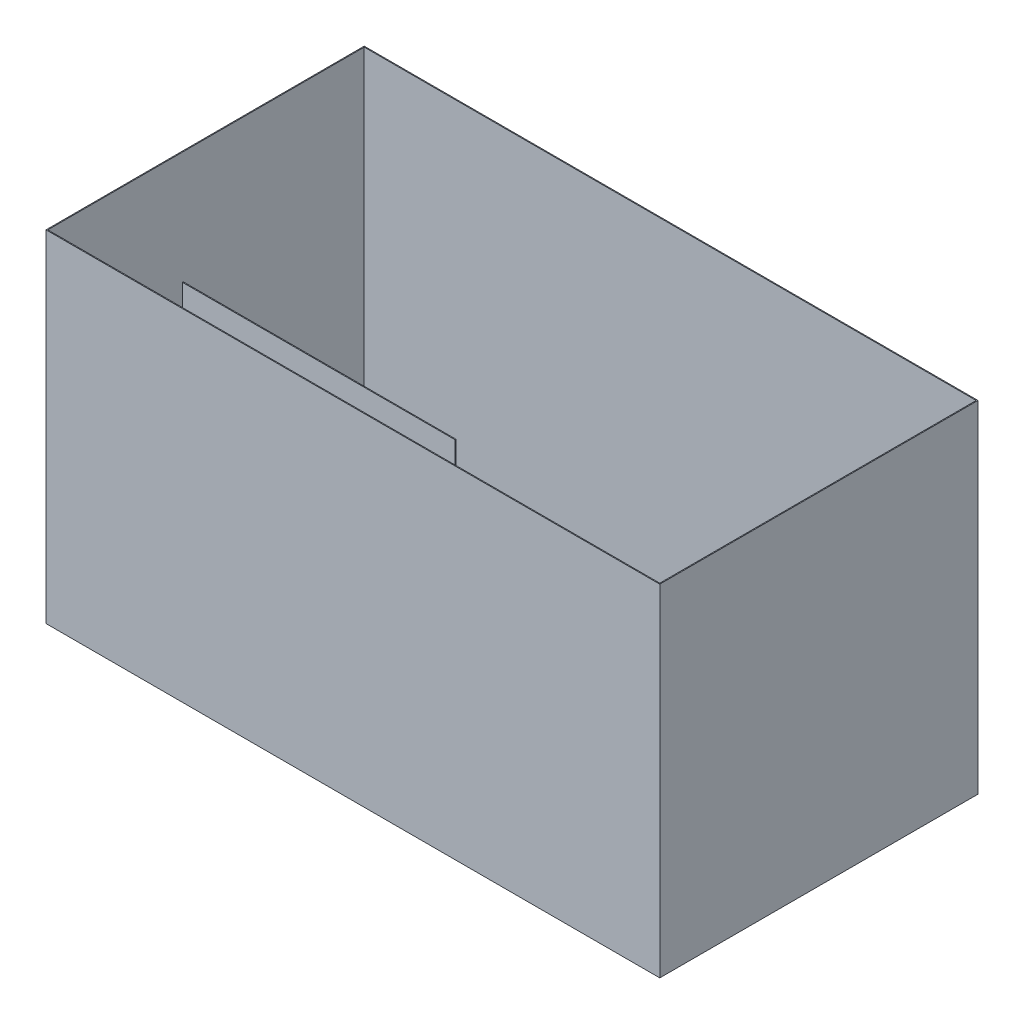
ISO-10303-21;
HEADER;
FILE_DESCRIPTION(('STEP AP214'),'2;1');
FILE_NAME('part.step','',(''),(''),'','','');
FILE_SCHEMA(('AUTOMOTIVE_DESIGN { 1 0 10303 214 1 1 1 1 }'));
ENDSEC;
DATA;
#1=APPLICATION_CONTEXT('core data for automotive mechanical design processes');
#2=APPLICATION_PROTOCOL_DEFINITION('international standard','automotive_design',2000,#1);
#3=PRODUCT_CONTEXT('',#1,'mechanical');
#4=PRODUCT('Part','Part','',(#3));
#5=PRODUCT_RELATED_PRODUCT_CATEGORY('part','',(#4));
#6=PRODUCT_DEFINITION_FORMATION('','',#4);
#7=PRODUCT_DEFINITION_CONTEXT('part definition',#1,'design');
#8=PRODUCT_DEFINITION('design','',#6,#7);
#9=PRODUCT_DEFINITION_SHAPE('','',#8);
#10=(LENGTH_UNIT() NAMED_UNIT(*) SI_UNIT(.MILLI.,.METRE.));
#11=(NAMED_UNIT(*) PLANE_ANGLE_UNIT() SI_UNIT($,.RADIAN.));
#12=(NAMED_UNIT(*) SI_UNIT($,.STERADIAN.) SOLID_ANGLE_UNIT());
#13=UNCERTAINTY_MEASURE_WITH_UNIT(LENGTH_MEASURE(1.E-05),#10,'distance_accuracy_value','');
#14=(GEOMETRIC_REPRESENTATION_CONTEXT(3) GLOBAL_UNCERTAINTY_ASSIGNED_CONTEXT((#13)) GLOBAL_UNIT_ASSIGNED_CONTEXT((#10,
#11,#12)) REPRESENTATION_CONTEXT('',''));
#15=CARTESIAN_POINT('',(0.,0.,0.));
#16=DIRECTION('',(0.,0.,1.));
#17=DIRECTION('',(1.,0.,0.));
#18=AXIS2_PLACEMENT_3D('',#15,#16,#17);
#19=CARTESIAN_POINT('',(50.,550.,-250.));
#20=DIRECTION('',(1.,0.,0.));
#21=DIRECTION('',(0.,0.,-1.));
#22=AXIS2_PLACEMENT_3D('',#19,#20,#21);
#23=PLANE('',#22);
#24=DIRECTION('',(0.,0.,1.));
#25=VECTOR('',#24,1.);
#26=CARTESIAN_POINT('',(50.,100.,-250.));
#27=LINE('',#26,#25);
#28=CARTESIAN_POINT('',(50.,100.,-252.));
#29=VERTEX_POINT('',#28);
#30=CARTESIAN_POINT('',(50.,100.,-250.));
#31=VERTEX_POINT('',#30);
#32=EDGE_CURVE('E116',#29,#31,#27,.T.);
#33=ORIENTED_EDGE('',*,*,#32,.T.);
#34=DIRECTION('',(0.,-1.,0.));
#35=VECTOR('',#34,1.);
#36=CARTESIAN_POINT('',(50.,550.,-250.));
#37=LINE('',#36,#35);
#38=CARTESIAN_POINT('',(50.,550.,-250.));
#39=VERTEX_POINT('',#38);
#40=EDGE_CURVE('E12',#39,#31,#37,.T.);
#41=ORIENTED_EDGE('',*,*,#40,.F.);
#42=DIRECTION('',(0.,0.,1.));
#43=VECTOR('',#42,1.);
#44=CARTESIAN_POINT('',(50.,550.,-250.));
#45=LINE('',#44,#43);
#46=CARTESIAN_POINT('',(50.,550.,-252.));
#47=VERTEX_POINT('',#46);
#48=EDGE_CURVE('E102',#47,#39,#45,.T.);
#49=ORIENTED_EDGE('',*,*,#48,.F.);
#50=DIRECTION('',(0.,-1.,0.));
#51=VECTOR('',#50,1.);
#52=CARTESIAN_POINT('',(50.,550.,-252.));
#53=LINE('',#52,#51);
#54=EDGE_CURVE('E115',#47,#29,#53,.T.);
#55=ORIENTED_EDGE('',*,*,#54,.T.);
#56=EDGE_LOOP('',(#33,#41,#49,#55));
#57=FACE_BOUND('',#56,.T.);
#58=ADVANCED_FACE('F52',(#57),#23,.F.);
#59=CARTESIAN_POINT('',(50.,550.,-250.));
#60=DIRECTION('',(0.,0.,-1.));
#61=DIRECTION('',(-1.,0.,0.));
#62=AXIS2_PLACEMENT_3D('',#59,#60,#61);
#63=PLANE('',#62);
#64=DIRECTION('',(1.,0.,0.));
#65=VECTOR('',#64,1.);
#66=CARTESIAN_POINT('',(50.,100.,-250.));
#67=LINE('',#66,#65);
#68=CARTESIAN_POINT('',(650.,100.,-250.));
#69=VERTEX_POINT('',#68);
#70=EDGE_CURVE('E107',#31,#69,#67,.T.);
#71=ORIENTED_EDGE('',*,*,#70,.T.);
#72=DIRECTION('',(0.,-1.,0.));
#73=VECTOR('',#72,1.);
#74=CARTESIAN_POINT('',(650.,550.,-250.));
#75=LINE('',#74,#73);
#76=CARTESIAN_POINT('',(650.,550.,-250.));
#77=VERTEX_POINT('',#76);
#78=EDGE_CURVE('E61',#77,#69,#75,.T.);
#79=ORIENTED_EDGE('',*,*,#78,.F.);
#80=DIRECTION('',(1.,0.,0.));
#81=VECTOR('',#80,1.);
#82=CARTESIAN_POINT('',(50.,550.,-250.));
#83=LINE('',#82,#81);
#84=EDGE_CURVE('E97',#39,#77,#83,.T.);
#85=ORIENTED_EDGE('',*,*,#84,.F.);
#86=ORIENTED_EDGE('',*,*,#40,.T.);
#87=EDGE_LOOP('',(#71,#79,#85,#86));
#88=FACE_BOUND('',#87,.T.);
#89=ADVANCED_FACE('F110',(#88),#63,.F.);
#90=CARTESIAN_POINT('',(650.,550.,-250.));
#91=DIRECTION('',(-1.,0.,0.));
#92=DIRECTION('',(0.,0.,1.));
#93=AXIS2_PLACEMENT_3D('',#90,#91,#92);
#94=PLANE('',#93);
#95=DIRECTION('',(0.,0.,-1.));
#96=VECTOR('',#95,1.);
#97=CARTESIAN_POINT('',(650.,100.,-250.));
#98=LINE('',#97,#96);
#99=CARTESIAN_POINT('',(650.,100.,-252.));
#100=VERTEX_POINT('',#99);
#101=EDGE_CURVE('E88',#69,#100,#98,.T.);
#102=ORIENTED_EDGE('',*,*,#101,.T.);
#103=DIRECTION('',(0.,-1.,0.));
#104=VECTOR('',#103,1.);
#105=CARTESIAN_POINT('',(650.,550.,-252.));
#106=LINE('',#105,#104);
#107=CARTESIAN_POINT('',(650.,550.,-252.));
#108=VERTEX_POINT('',#107);
#109=EDGE_CURVE('E108',#108,#100,#106,.T.);
#110=ORIENTED_EDGE('',*,*,#109,.F.);
#111=DIRECTION('',(0.,0.,-1.));
#112=VECTOR('',#111,1.);
#113=CARTESIAN_POINT('',(650.,550.,-250.));
#114=LINE('',#113,#112);
#115=EDGE_CURVE('E105',#77,#108,#114,.T.);
#116=ORIENTED_EDGE('',*,*,#115,.F.);
#117=ORIENTED_EDGE('',*,*,#78,.T.);
#118=EDGE_LOOP('',(#102,#110,#116,#117));
#119=FACE_BOUND('',#118,.T.);
#120=ADVANCED_FACE('F109',(#119),#94,.F.);
#121=CARTESIAN_POINT('',(50.,550.,-252.));
#122=DIRECTION('',(0.,0.,1.));
#123=DIRECTION('',(1.,0.,0.));
#124=AXIS2_PLACEMENT_3D('',#121,#122,#123);
#125=PLANE('',#124);
#126=DIRECTION('',(-1.,0.,0.));
#127=VECTOR('',#126,1.);
#128=CARTESIAN_POINT('',(50.,100.,-252.));
#129=LINE('',#128,#127);
#130=EDGE_CURVE('E95',#100,#29,#129,.T.);
#131=ORIENTED_EDGE('',*,*,#130,.T.);
#132=ORIENTED_EDGE('',*,*,#54,.F.);
#133=DIRECTION('',(-1.,0.,0.));
#134=VECTOR('',#133,1.);
#135=CARTESIAN_POINT('',(50.,550.,-252.));
#136=LINE('',#135,#134);
#137=EDGE_CURVE('E66',#108,#47,#136,.T.);
#138=ORIENTED_EDGE('',*,*,#137,.F.);
#139=ORIENTED_EDGE('',*,*,#109,.T.);
#140=EDGE_LOOP('',(#131,#132,#138,#139));
#141=FACE_BOUND('',#140,.T.);
#142=ADVANCED_FACE('F125',(#141),#125,.F.);
#143=CARTESIAN_POINT('',(0.,550.,0.));
#144=DIRECTION('',(0.,-1.,0.));
#145=DIRECTION('',(0.,0.,-1.));
#146=AXIS2_PLACEMENT_3D('',#143,#144,#145);
#147=PLANE('',#146);
#148=ORIENTED_EDGE('',*,*,#48,.T.);
#149=ORIENTED_EDGE('',*,*,#84,.T.);
#150=ORIENTED_EDGE('',*,*,#115,.T.);
#151=ORIENTED_EDGE('',*,*,#137,.T.);
#152=EDGE_LOOP('',(#148,#149,#150,#151));
#153=FACE_BOUND('',#152,.T.);
#154=ADVANCED_FACE('F99',(#153),#147,.F.);
#155=CARTESIAN_POINT('',(0.,100.,0.));
#156=DIRECTION('',(0.,-1.,0.));
#157=DIRECTION('',(0.,0.,-1.));
#158=AXIS2_PLACEMENT_3D('',#155,#156,#157);
#159=PLANE('',#158);
#160=ORIENTED_EDGE('',*,*,#32,.F.);
#161=ORIENTED_EDGE('',*,*,#130,.F.);
#162=ORIENTED_EDGE('',*,*,#101,.F.);
#163=ORIENTED_EDGE('',*,*,#70,.F.);
#164=EDGE_LOOP('',(#160,#161,#162,#163));
#165=FACE_BOUND('',#164,.T.);
#166=ADVANCED_FACE('F127',(#165),#159,.T.);
#167=CLOSED_SHELL('',(#58,#89,#120,#142,#154,#166));
#168=MANIFOLD_SOLID_BREP('B2',#167);
#169=CARTESIAN_POINT('',(0.,750.,0.));
#170=DIRECTION('',(0.,-1.,0.));
#171=DIRECTION('',(0.,0.,-1.));
#172=AXIS2_PLACEMENT_3D('',#169,#170,#171);
#173=PLANE('',#172);
#174=DIRECTION('',(0.,0.,1.));
#175=VECTOR('',#174,1.);
#176=CARTESIAN_POINT('',(0.,750.,0.));
#177=LINE('',#176,#175);
#178=CARTESIAN_POINT('',(0.,750.,-700.));
#179=VERTEX_POINT('',#178);
#180=CARTESIAN_POINT('',(0.,750.,0.));
#181=VERTEX_POINT('',#180);
#182=EDGE_CURVE('E285',#179,#181,#177,.T.);
#183=ORIENTED_EDGE('',*,*,#182,.T.);
#184=DIRECTION('',(1.,0.,0.));
#185=VECTOR('',#184,1.);
#186=CARTESIAN_POINT('',(0.,750.,0.));
#187=LINE('',#186,#185);
#188=CARTESIAN_POINT('',(1350.,750.,0.));
#189=VERTEX_POINT('',#188);
#190=EDGE_CURVE('E228',#181,#189,#187,.T.);
#191=ORIENTED_EDGE('',*,*,#190,.T.);
#192=DIRECTION('',(0.,0.,-1.));
#193=VECTOR('',#192,1.);
#194=CARTESIAN_POINT('',(1350.,750.,0.));
#195=LINE('',#194,#193);
#196=CARTESIAN_POINT('',(1350.,750.,-700.));
#197=VERTEX_POINT('',#196);
#198=EDGE_CURVE('E290',#189,#197,#195,.T.);
#199=ORIENTED_EDGE('',*,*,#198,.T.);
#200=DIRECTION('',(-1.,0.,0.));
#201=VECTOR('',#200,1.);
#202=CARTESIAN_POINT('',(0.,750.,-700.));
#203=LINE('',#202,#201);
#204=EDGE_CURVE('E203',#197,#179,#203,.T.);
#205=ORIENTED_EDGE('',*,*,#204,.T.);
#206=EDGE_LOOP('',(#183,#191,#199,#205));
#207=FACE_BOUND('',#206,.T.);
#208=DIRECTION('',(0.,0.,1.));
#209=VECTOR('',#208,1.);
#210=CARTESIAN_POINT('',(2.,750.,0.));
#211=LINE('',#210,#209);
#212=CARTESIAN_POINT('',(2.,750.,-698.));
#213=VERTEX_POINT('',#212);
#214=CARTESIAN_POINT('',(2.,750.,-2.));
#215=VERTEX_POINT('',#214);
#216=EDGE_CURVE('E273',#213,#215,#211,.T.);
#217=ORIENTED_EDGE('',*,*,#216,.F.);
#218=DIRECTION('',(-1.,0.,0.));
#219=VECTOR('',#218,1.);
#220=CARTESIAN_POINT('',(0.,750.,-698.));
#221=LINE('',#220,#219);
#222=CARTESIAN_POINT('',(1348.,750.,-698.));
#223=VERTEX_POINT('',#222);
#224=EDGE_CURVE('E284',#223,#213,#221,.T.);
#225=ORIENTED_EDGE('',*,*,#224,.F.);
#226=DIRECTION('',(0.,0.,-1.));
#227=VECTOR('',#226,1.);
#228=CARTESIAN_POINT('',(1348.,750.,0.));
#229=LINE('',#228,#227);
#230=CARTESIAN_POINT('',(1348.,750.,-2.));
#231=VERTEX_POINT('',#230);
#232=EDGE_CURVE('E281',#231,#223,#229,.T.);
#233=ORIENTED_EDGE('',*,*,#232,.F.);
#234=DIRECTION('',(1.,0.,0.));
#235=VECTOR('',#234,1.);
#236=CARTESIAN_POINT('',(0.,750.,-2.));
#237=LINE('',#236,#235);
#238=EDGE_CURVE('E266',#215,#231,#237,.T.);
#239=ORIENTED_EDGE('',*,*,#238,.F.);
#240=EDGE_LOOP('',(#217,#225,#233,#239));
#241=FACE_BOUND('',#240,.T.);
#242=ADVANCED_FACE('F179',(#207,#241),#173,.F.);
#243=CARTESIAN_POINT('',(0.,750.,0.));
#244=DIRECTION('',(1.,0.,0.));
#245=DIRECTION('',(0.,0.,-1.));
#246=AXIS2_PLACEMENT_3D('',#243,#244,#245);
#247=PLANE('',#246);
#248=DIRECTION('',(0.,0.,1.));
#249=VECTOR('',#248,1.);
#250=CARTESIAN_POINT('',(0.,0.,0.));
#251=LINE('',#250,#249);
#252=CARTESIAN_POINT('',(0.,0.,-700.));
#253=VERTEX_POINT('',#252);
#254=CARTESIAN_POINT('',(0.,0.,0.));
#255=VERTEX_POINT('',#254);
#256=EDGE_CURVE('E295',#253,#255,#251,.T.);
#257=ORIENTED_EDGE('',*,*,#256,.T.);
#258=DIRECTION('',(0.,-1.,0.));
#259=VECTOR('',#258,1.);
#260=CARTESIAN_POINT('',(0.,750.,0.));
#261=LINE('',#260,#259);
#262=EDGE_CURVE('E51',#181,#255,#261,.T.);
#263=ORIENTED_EDGE('',*,*,#262,.F.);
#264=ORIENTED_EDGE('',*,*,#182,.F.);
#265=DIRECTION('',(0.,-1.,0.));
#266=VECTOR('',#265,1.);
#267=CARTESIAN_POINT('',(0.,750.,-700.));
#268=LINE('',#267,#266);
#269=EDGE_CURVE('E292',#179,#253,#268,.T.);
#270=ORIENTED_EDGE('',*,*,#269,.T.);
#271=EDGE_LOOP('',(#257,#263,#264,#270));
#272=FACE_BOUND('',#271,.T.);
#273=ADVANCED_FACE('F176',(#272),#247,.F.);
#274=CARTESIAN_POINT('',(0.,750.,0.));
#275=DIRECTION('',(0.,0.,-1.));
#276=DIRECTION('',(-1.,0.,0.));
#277=AXIS2_PLACEMENT_3D('',#274,#275,#276);
#278=PLANE('',#277);
#279=DIRECTION('',(1.,0.,0.));
#280=VECTOR('',#279,1.);
#281=CARTESIAN_POINT('',(0.,0.,0.));
#282=LINE('',#281,#280);
#283=CARTESIAN_POINT('',(1350.,0.,0.));
#284=VERTEX_POINT('',#283);
#285=EDGE_CURVE('E293',#255,#284,#282,.T.);
#286=ORIENTED_EDGE('',*,*,#285,.T.);
#287=DIRECTION('',(0.,-1.,0.));
#288=VECTOR('',#287,1.);
#289=CARTESIAN_POINT('',(1350.,750.,0.));
#290=LINE('',#289,#288);
#291=EDGE_CURVE('E183',#189,#284,#290,.T.);
#292=ORIENTED_EDGE('',*,*,#291,.F.);
#293=ORIENTED_EDGE('',*,*,#190,.F.);
#294=ORIENTED_EDGE('',*,*,#262,.T.);
#295=EDGE_LOOP('',(#286,#292,#293,#294));
#296=FACE_BOUND('',#295,.T.);
#297=ADVANCED_FACE('F323',(#296),#278,.F.);
#298=CARTESIAN_POINT('',(1350.,750.,0.));
#299=DIRECTION('',(-1.,0.,0.));
#300=DIRECTION('',(0.,0.,1.));
#301=AXIS2_PLACEMENT_3D('',#298,#299,#300);
#302=PLANE('',#301);
#303=DIRECTION('',(0.,0.,-1.));
#304=VECTOR('',#303,1.);
#305=CARTESIAN_POINT('',(1350.,0.,0.));
#306=LINE('',#305,#304);
#307=CARTESIAN_POINT('',(1350.,0.,-700.));
#308=VERTEX_POINT('',#307);
#309=EDGE_CURVE('E297',#284,#308,#306,.T.);
#310=ORIENTED_EDGE('',*,*,#309,.T.);
#311=DIRECTION('',(0.,-1.,0.));
#312=VECTOR('',#311,1.);
#313=CARTESIAN_POINT('',(1350.,750.,-700.));
#314=LINE('',#313,#312);
#315=EDGE_CURVE('E302',#197,#308,#314,.T.);
#316=ORIENTED_EDGE('',*,*,#315,.F.);
#317=ORIENTED_EDGE('',*,*,#198,.F.);
#318=ORIENTED_EDGE('',*,*,#291,.T.);
#319=EDGE_LOOP('',(#310,#316,#317,#318));
#320=FACE_BOUND('',#319,.T.);
#321=ADVANCED_FACE('F308',(#320),#302,.F.);
#322=CARTESIAN_POINT('',(0.,750.,-700.));
#323=DIRECTION('',(0.,0.,1.));
#324=DIRECTION('',(1.,0.,0.));
#325=AXIS2_PLACEMENT_3D('',#322,#323,#324);
#326=PLANE('',#325);
#327=DIRECTION('',(-1.,0.,0.));
#328=VECTOR('',#327,1.);
#329=CARTESIAN_POINT('',(0.,0.,-700.));
#330=LINE('',#329,#328);
#331=EDGE_CURVE('E225',#308,#253,#330,.T.);
#332=ORIENTED_EDGE('',*,*,#331,.T.);
#333=ORIENTED_EDGE('',*,*,#269,.F.);
#334=ORIENTED_EDGE('',*,*,#204,.F.);
#335=ORIENTED_EDGE('',*,*,#315,.T.);
#336=EDGE_LOOP('',(#332,#333,#334,#335));
#337=FACE_BOUND('',#336,.T.);
#338=ADVANCED_FACE('F314',(#337),#326,.F.);
#339=CARTESIAN_POINT('',(0.,0.,0.));
#340=DIRECTION('',(0.,-1.,0.));
#341=DIRECTION('',(0.,0.,-1.));
#342=AXIS2_PLACEMENT_3D('',#339,#340,#341);
#343=PLANE('',#342);
#344=ORIENTED_EDGE('',*,*,#256,.F.);
#345=ORIENTED_EDGE('',*,*,#331,.F.);
#346=ORIENTED_EDGE('',*,*,#309,.F.);
#347=ORIENTED_EDGE('',*,*,#285,.F.);
#348=EDGE_LOOP('',(#344,#345,#346,#347));
#349=FACE_BOUND('',#348,.T.);
#350=ADVANCED_FACE('F309',(#349),#343,.T.);
#351=CARTESIAN_POINT('',(2.,750.,0.));
#352=DIRECTION('',(1.,0.,0.));
#353=DIRECTION('',(0.,0.,-1.));
#354=AXIS2_PLACEMENT_3D('',#351,#352,#353);
#355=PLANE('',#354);
#356=DIRECTION('',(0.,0.,1.));
#357=VECTOR('',#356,1.);
#358=CARTESIAN_POINT('',(2.,2.,0.));
#359=LINE('',#358,#357);
#360=CARTESIAN_POINT('',(2.,2.,-698.));
#361=VERTEX_POINT('',#360);
#362=CARTESIAN_POINT('',(2.,2.,-2.));
#363=VERTEX_POINT('',#362);
#364=EDGE_CURVE('E260',#361,#363,#359,.T.);
#365=ORIENTED_EDGE('',*,*,#364,.F.);
#366=DIRECTION('',(0.,-1.,0.));
#367=VECTOR('',#366,1.);
#368=CARTESIAN_POINT('',(2.,750.,-698.));
#369=LINE('',#368,#367);
#370=EDGE_CURVE('E280',#213,#361,#369,.T.);
#371=ORIENTED_EDGE('',*,*,#370,.F.);
#372=ORIENTED_EDGE('',*,*,#216,.T.);
#373=DIRECTION('',(0.,-1.,0.));
#374=VECTOR('',#373,1.);
#375=CARTESIAN_POINT('',(2.,750.,-2.));
#376=LINE('',#375,#374);
#377=EDGE_CURVE('E267',#215,#363,#376,.T.);
#378=ORIENTED_EDGE('',*,*,#377,.T.);
#379=EDGE_LOOP('',(#365,#371,#372,#378));
#380=FACE_BOUND('',#379,.T.);
#381=ADVANCED_FACE('F321',(#380),#355,.T.);
#382=CARTESIAN_POINT('',(0.,750.,-2.));
#383=DIRECTION('',(0.,0.,-1.));
#384=DIRECTION('',(-1.,0.,0.));
#385=AXIS2_PLACEMENT_3D('',#382,#383,#384);
#386=PLANE('',#385);
#387=DIRECTION('',(1.,0.,0.));
#388=VECTOR('',#387,1.);
#389=CARTESIAN_POINT('',(0.,2.,-2.));
#390=LINE('',#389,#388);
#391=CARTESIAN_POINT('',(1348.,2.,-2.));
#392=VERTEX_POINT('',#391);
#393=EDGE_CURVE('E253',#363,#392,#390,.T.);
#394=ORIENTED_EDGE('',*,*,#393,.F.);
#395=ORIENTED_EDGE('',*,*,#377,.F.);
#396=ORIENTED_EDGE('',*,*,#238,.T.);
#397=DIRECTION('',(0.,-1.,0.));
#398=VECTOR('',#397,1.);
#399=CARTESIAN_POINT('',(1348.,750.,-2.));
#400=LINE('',#399,#398);
#401=EDGE_CURVE('E263',#231,#392,#400,.T.);
#402=ORIENTED_EDGE('',*,*,#401,.T.);
#403=EDGE_LOOP('',(#394,#395,#396,#402));
#404=FACE_BOUND('',#403,.T.);
#405=ADVANCED_FACE('F262',(#404),#386,.T.);
#406=CARTESIAN_POINT('',(1348.,750.,0.));
#407=DIRECTION('',(-1.,0.,0.));
#408=DIRECTION('',(0.,0.,1.));
#409=AXIS2_PLACEMENT_3D('',#406,#407,#408);
#410=PLANE('',#409);
#411=DIRECTION('',(0.,0.,-1.));
#412=VECTOR('',#411,1.);
#413=CARTESIAN_POINT('',(1348.,2.,0.));
#414=LINE('',#413,#412);
#415=CARTESIAN_POINT('',(1348.,2.,-698.));
#416=VERTEX_POINT('',#415);
#417=EDGE_CURVE('E254',#392,#416,#414,.T.);
#418=ORIENTED_EDGE('',*,*,#417,.F.);
#419=ORIENTED_EDGE('',*,*,#401,.F.);
#420=ORIENTED_EDGE('',*,*,#232,.T.);
#421=DIRECTION('',(0.,-1.,0.));
#422=VECTOR('',#421,1.);
#423=CARTESIAN_POINT('',(1348.,750.,-698.));
#424=LINE('',#423,#422);
#425=EDGE_CURVE('E194',#223,#416,#424,.T.);
#426=ORIENTED_EDGE('',*,*,#425,.T.);
#427=EDGE_LOOP('',(#418,#419,#420,#426));
#428=FACE_BOUND('',#427,.T.);
#429=ADVANCED_FACE('F271',(#428),#410,.T.);
#430=CARTESIAN_POINT('',(0.,750.,-698.));
#431=DIRECTION('',(0.,0.,1.));
#432=DIRECTION('',(1.,0.,0.));
#433=AXIS2_PLACEMENT_3D('',#430,#431,#432);
#434=PLANE('',#433);
#435=DIRECTION('',(-1.,0.,0.));
#436=VECTOR('',#435,1.);
#437=CARTESIAN_POINT('',(0.,2.,-698.));
#438=LINE('',#437,#436);
#439=EDGE_CURVE('E275',#416,#361,#438,.T.);
#440=ORIENTED_EDGE('',*,*,#439,.F.);
#441=ORIENTED_EDGE('',*,*,#425,.F.);
#442=ORIENTED_EDGE('',*,*,#224,.T.);
#443=ORIENTED_EDGE('',*,*,#370,.T.);
#444=EDGE_LOOP('',(#440,#441,#442,#443));
#445=FACE_BOUND('',#444,.T.);
#446=ADVANCED_FACE('F333',(#445),#434,.T.);
#447=CARTESIAN_POINT('',(0.,2.,0.));
#448=DIRECTION('',(0.,-1.,0.));
#449=DIRECTION('',(0.,0.,-1.));
#450=AXIS2_PLACEMENT_3D('',#447,#448,#449);
#451=PLANE('',#450);
#452=ORIENTED_EDGE('',*,*,#364,.T.);
#453=ORIENTED_EDGE('',*,*,#393,.T.);
#454=ORIENTED_EDGE('',*,*,#417,.T.);
#455=ORIENTED_EDGE('',*,*,#439,.T.);
#456=EDGE_LOOP('',(#452,#453,#454,#455));
#457=FACE_BOUND('',#456,.T.);
#458=ADVANCED_FACE('F251',(#457),#451,.F.);
#459=CLOSED_SHELL('',(#242,#273,#297,#321,#338,#350,#381,#405,#429,#446,#458));
#460=MANIFOLD_SOLID_BREP('B6',#459);
#461=ADVANCED_BREP_SHAPE_REPRESENTATION('',(#18,#168,#460),#14);
#462=SHAPE_DEFINITION_REPRESENTATION(#9,#461);
ENDSEC;
END-ISO-10303-21;
